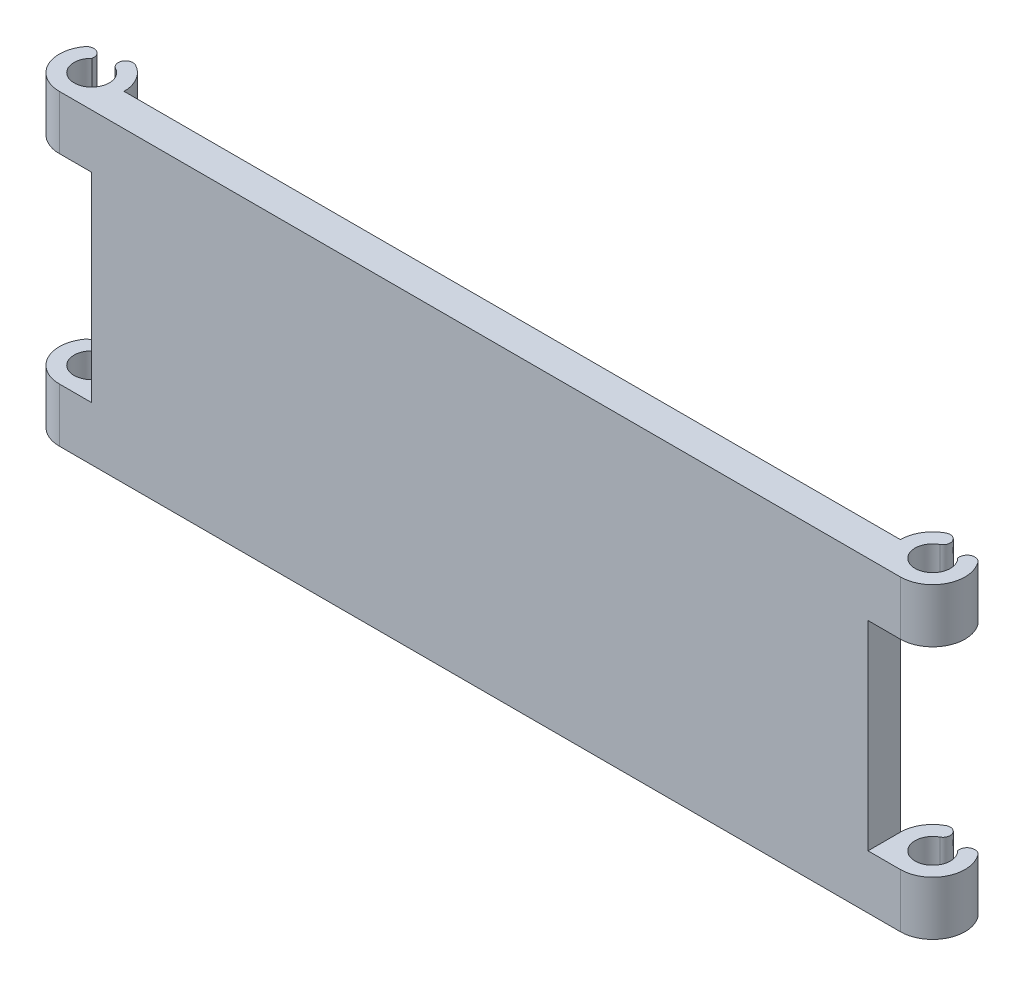
ISO-10303-21;
HEADER;
FILE_DESCRIPTION(('STEP AP214'),'2;1');
FILE_NAME('part.step','',(''),(''),'','','');
FILE_SCHEMA(('AUTOMOTIVE_DESIGN { 1 0 10303 214 1 1 1 1 }'));
ENDSEC;
DATA;
#1=APPLICATION_CONTEXT('core data for automotive mechanical design processes');
#2=APPLICATION_PROTOCOL_DEFINITION('international standard','automotive_design',2000,#1);
#3=PRODUCT_CONTEXT('',#1,'mechanical');
#4=PRODUCT('Part','Part','',(#3));
#5=PRODUCT_RELATED_PRODUCT_CATEGORY('part','',(#4));
#6=PRODUCT_DEFINITION_FORMATION('','',#4);
#7=PRODUCT_DEFINITION_CONTEXT('part definition',#1,'design');
#8=PRODUCT_DEFINITION('design','',#6,#7);
#9=PRODUCT_DEFINITION_SHAPE('','',#8);
#10=(LENGTH_UNIT() NAMED_UNIT(*) SI_UNIT(.MILLI.,.METRE.));
#11=(NAMED_UNIT(*) PLANE_ANGLE_UNIT() SI_UNIT($,.RADIAN.));
#12=(NAMED_UNIT(*) SI_UNIT($,.STERADIAN.) SOLID_ANGLE_UNIT());
#13=UNCERTAINTY_MEASURE_WITH_UNIT(LENGTH_MEASURE(1.E-05),#10,'distance_accuracy_value','');
#14=(GEOMETRIC_REPRESENTATION_CONTEXT(3) GLOBAL_UNCERTAINTY_ASSIGNED_CONTEXT((#13)) GLOBAL_UNIT_ASSIGNED_CONTEXT((#10,
#11,#12)) REPRESENTATION_CONTEXT('',''));
#15=CARTESIAN_POINT('',(0.,0.,0.));
#16=DIRECTION('',(0.,0.,1.));
#17=DIRECTION('',(1.,0.,0.));
#18=AXIS2_PLACEMENT_3D('',#15,#16,#17);
#19=CARTESIAN_POINT('',(-81.6966425521741,57.,-2.67008988531395));
#20=DIRECTION('',(0.,-1.,0.));
#21=DIRECTION('',(0.,0.,-1.));
#22=AXIS2_PLACEMENT_3D('',#19,#20,#21);
#23=CYLINDRICAL_SURFACE('',#22,1.43989625620209);
#24=CARTESIAN_POINT('',(-81.6966425521741,10.,-2.67008988531395));
#25=DIRECTION('',(0.,1.,0.));
#26=DIRECTION('',(0.,0.,1.));
#27=AXIS2_PLACEMENT_3D('',#24,#25,#26);
#28=CIRCLE('',#27,1.43989625620209);
#29=CARTESIAN_POINT('',(-80.2962462943004,10.,-2.33513981506707));
#30=VERTEX_POINT('',#29);
#31=CARTESIAN_POINT('',(-82.8638927005138,10.,-3.51319623674632));
#32=VERTEX_POINT('',#31);
#33=EDGE_CURVE('E293',#30,#32,#28,.T.);
#34=ORIENTED_EDGE('',*,*,#33,.F.);
#35=DIRECTION('',(0.,-1.,0.));
#36=VECTOR('',#35,1.);
#37=CARTESIAN_POINT('',(-80.2962462943004,57.,-2.33513981506707));
#38=LINE('',#37,#36);
#39=CARTESIAN_POINT('',(-80.2962462943004,0.,-2.33513981506707));
#40=VERTEX_POINT('',#39);
#41=EDGE_CURVE('E356',#30,#40,#38,.T.);
#42=ORIENTED_EDGE('',*,*,#41,.T.);
#43=CARTESIAN_POINT('',(-81.6966425521741,0.,-2.67008988531395));
#44=DIRECTION('',(0.,1.,0.));
#45=DIRECTION('',(0.,0.,1.));
#46=AXIS2_PLACEMENT_3D('',#43,#44,#45);
#47=CIRCLE('',#46,1.43989625620209);
#48=CARTESIAN_POINT('',(-82.8638927005138,0.,-3.51319623674632));
#49=VERTEX_POINT('',#48);
#50=EDGE_CURVE('E317',#40,#49,#47,.T.);
#51=ORIENTED_EDGE('',*,*,#50,.T.);
#52=DIRECTION('',(0.,-1.,0.));
#53=VECTOR('',#52,1.);
#54=CARTESIAN_POINT('',(-82.8638927005138,57.,-3.51319623674632));
#55=LINE('',#54,#53);
#56=EDGE_CURVE('E455',#32,#49,#55,.T.);
#57=ORIENTED_EDGE('',*,*,#56,.F.);
#58=EDGE_LOOP('',(#34,#42,#51,#57));
#59=FACE_BOUND('',#58,.T.);
#60=ADVANCED_FACE('F41',(#59),#23,.T.);
#61=CARTESIAN_POINT('',(-78.,57.,0.));
#62=DIRECTION('',(0.,-1.,0.));
#63=DIRECTION('',(0.,0.,-1.));
#64=AXIS2_PLACEMENT_3D('',#61,#62,#63);
#65=CYLINDRICAL_SURFACE('',#64,6.);
#66=CARTESIAN_POINT('',(-78.,10.,0.));
#67=DIRECTION('',(0.,1.,0.));
#68=DIRECTION('',(0.,0.,1.));
#69=AXIS2_PLACEMENT_3D('',#66,#67,#68);
#70=CIRCLE('',#69,6.);
#71=CARTESIAN_POINT('',(-78.,10.,6.));
#72=VERTEX_POINT('',#71);
#73=EDGE_CURVE('E258',#32,#72,#70,.T.);
#74=ORIENTED_EDGE('',*,*,#73,.F.);
#75=ORIENTED_EDGE('',*,*,#56,.T.);
#76=CARTESIAN_POINT('',(-78.,0.,0.));
#77=DIRECTION('',(0.,1.,0.));
#78=DIRECTION('',(0.,0.,1.));
#79=AXIS2_PLACEMENT_3D('',#76,#77,#78);
#80=CIRCLE('',#79,6.);
#81=CARTESIAN_POINT('',(-78.,0.,6.));
#82=VERTEX_POINT('',#81);
#83=EDGE_CURVE('E360',#49,#82,#80,.T.);
#84=ORIENTED_EDGE('',*,*,#83,.T.);
#85=DIRECTION('',(0.,-1.,0.));
#86=VECTOR('',#85,1.);
#87=CARTESIAN_POINT('',(-78.,57.,6.));
#88=LINE('',#87,#86);
#89=EDGE_CURVE('E450',#72,#82,#88,.T.);
#90=ORIENTED_EDGE('',*,*,#89,.F.);
#91=EDGE_LOOP('',(#74,#75,#84,#90));
#92=FACE_BOUND('',#91,.T.);
#93=ADVANCED_FACE('F522',(#92),#65,.T.);
#94=CARTESIAN_POINT('',(78.,57.,6.));
#95=DIRECTION('',(0.,0.,-1.));
#96=DIRECTION('',(-1.,0.,0.));
#97=AXIS2_PLACEMENT_3D('',#94,#95,#96);
#98=PLANE('',#97);
#99=DIRECTION('',(1.,0.,0.));
#100=VECTOR('',#99,1.);
#101=CARTESIAN_POINT('',(78.,10.,6.));
#102=LINE('',#101,#100);
#103=CARTESIAN_POINT('',(72.,10.,6.));
#104=VERTEX_POINT('',#103);
#105=CARTESIAN_POINT('',(78.,10.,6.));
#106=VERTEX_POINT('',#105);
#107=EDGE_CURVE('E226',#104,#106,#102,.T.);
#108=ORIENTED_EDGE('',*,*,#107,.F.);
#109=DIRECTION('',(0.,1.,0.));
#110=VECTOR('',#109,1.);
#111=CARTESIAN_POINT('',(72.,10.,6.));
#112=LINE('',#111,#110);
#113=CARTESIAN_POINT('',(72.,47.,6.));
#114=VERTEX_POINT('',#113);
#115=EDGE_CURVE('E212',#104,#114,#112,.T.);
#116=ORIENTED_EDGE('',*,*,#115,.T.);
#117=DIRECTION('',(1.,0.,0.));
#118=VECTOR('',#117,1.);
#119=CARTESIAN_POINT('',(78.,47.,6.));
#120=LINE('',#119,#118);
#121=CARTESIAN_POINT('',(78.,47.,6.));
#122=VERTEX_POINT('',#121);
#123=EDGE_CURVE('E251',#114,#122,#120,.T.);
#124=ORIENTED_EDGE('',*,*,#123,.T.);
#125=DIRECTION('',(0.,-1.,0.));
#126=VECTOR('',#125,1.);
#127=CARTESIAN_POINT('',(78.,57.,6.));
#128=LINE('',#127,#126);
#129=CARTESIAN_POINT('',(78.,57.,6.));
#130=VERTEX_POINT('',#129);
#131=EDGE_CURVE('E446',#130,#122,#128,.T.);
#132=ORIENTED_EDGE('',*,*,#131,.F.);
#133=DIRECTION('',(1.,0.,0.));
#134=VECTOR('',#133,1.);
#135=CARTESIAN_POINT('',(78.,57.,6.));
#136=LINE('',#135,#134);
#137=CARTESIAN_POINT('',(-78.,57.,6.));
#138=VERTEX_POINT('',#137);
#139=EDGE_CURVE('E326',#138,#130,#136,.T.);
#140=ORIENTED_EDGE('',*,*,#139,.F.);
#141=CARTESIAN_POINT('',(-78.,47.,6.));
#142=VERTEX_POINT('',#141);
#143=EDGE_CURVE('E451',#138,#142,#88,.T.);
#144=ORIENTED_EDGE('',*,*,#143,.T.);
#145=DIRECTION('',(1.,0.,0.));
#146=VECTOR('',#145,1.);
#147=CARTESIAN_POINT('',(-78.,47.,6.));
#148=LINE('',#147,#146);
#149=CARTESIAN_POINT('',(-72.,47.,6.));
#150=VERTEX_POINT('',#149);
#151=EDGE_CURVE('E270',#142,#150,#148,.T.);
#152=ORIENTED_EDGE('',*,*,#151,.T.);
#153=DIRECTION('',(0.,1.,0.));
#154=VECTOR('',#153,1.);
#155=CARTESIAN_POINT('',(-72.,10.,6.));
#156=LINE('',#155,#154);
#157=CARTESIAN_POINT('',(-72.,10.,6.));
#158=VERTEX_POINT('',#157);
#159=EDGE_CURVE('E265',#158,#150,#156,.T.);
#160=ORIENTED_EDGE('',*,*,#159,.F.);
#161=DIRECTION('',(1.,0.,0.));
#162=VECTOR('',#161,1.);
#163=CARTESIAN_POINT('',(-78.,10.,6.));
#164=LINE('',#163,#162);
#165=EDGE_CURVE('E257',#72,#158,#164,.T.);
#166=ORIENTED_EDGE('',*,*,#165,.F.);
#167=ORIENTED_EDGE('',*,*,#89,.T.);
#168=DIRECTION('',(1.,0.,0.));
#169=VECTOR('',#168,1.);
#170=CARTESIAN_POINT('',(78.,0.,6.));
#171=LINE('',#170,#169);
#172=CARTESIAN_POINT('',(78.,0.,6.));
#173=VERTEX_POINT('',#172);
#174=EDGE_CURVE('E364',#82,#173,#171,.T.);
#175=ORIENTED_EDGE('',*,*,#174,.T.);
#176=EDGE_CURVE('E237',#106,#173,#128,.T.);
#177=ORIENTED_EDGE('',*,*,#176,.F.);
#178=EDGE_LOOP('',(#108,#116,#124,#132,#140,#144,#152,#160,#166,#167,#175,#177));
#179=FACE_BOUND('',#178,.T.);
#180=ADVANCED_FACE('F235',(#179),#98,.F.);
#181=CARTESIAN_POINT('',(78.,57.,0.));
#182=DIRECTION('',(0.,-1.,0.));
#183=DIRECTION('',(0.,0.,-1.));
#184=AXIS2_PLACEMENT_3D('',#181,#182,#183);
#185=CYLINDRICAL_SURFACE('',#184,6.);
#186=CARTESIAN_POINT('',(78.,10.,0.));
#187=DIRECTION('',(0.,1.,0.));
#188=DIRECTION('',(0.,0.,1.));
#189=AXIS2_PLACEMENT_3D('',#186,#187,#188);
#190=CIRCLE('',#189,6.);
#191=CARTESIAN_POINT('',(82.8638927005138,10.,-3.51319623674632));
#192=VERTEX_POINT('',#191);
#193=EDGE_CURVE('E232',#106,#192,#190,.T.);
#194=ORIENTED_EDGE('',*,*,#193,.F.);
#195=ORIENTED_EDGE('',*,*,#176,.T.);
#196=CARTESIAN_POINT('',(78.,0.,0.));
#197=DIRECTION('',(0.,1.,0.));
#198=DIRECTION('',(0.,0.,-1.));
#199=AXIS2_PLACEMENT_3D('',#196,#197,#198);
#200=CIRCLE('',#199,6.);
#201=CARTESIAN_POINT('',(82.8638927005138,0.,-3.51319623674633));
#202=VERTEX_POINT('',#201);
#203=EDGE_CURVE('E367',#173,#202,#200,.T.);
#204=ORIENTED_EDGE('',*,*,#203,.T.);
#205=DIRECTION('',(0.,-1.,0.));
#206=VECTOR('',#205,1.);
#207=CARTESIAN_POINT('',(82.8638927005138,57.,-3.51319623674633));
#208=LINE('',#207,#206);
#209=EDGE_CURVE('E441',#192,#202,#208,.T.);
#210=ORIENTED_EDGE('',*,*,#209,.F.);
#211=EDGE_LOOP('',(#194,#195,#204,#210));
#212=FACE_BOUND('',#211,.T.);
#213=ADVANCED_FACE('F578',(#212),#185,.T.);
#214=CARTESIAN_POINT('',(81.6966425521741,57.,-2.67008988531395));
#215=DIRECTION('',(0.,-1.,0.));
#216=DIRECTION('',(0.,0.,-1.));
#217=AXIS2_PLACEMENT_3D('',#214,#215,#216);
#218=CYLINDRICAL_SURFACE('',#217,1.43989625620209);
#219=CARTESIAN_POINT('',(81.6966425521741,10.,-2.67008988531395));
#220=DIRECTION('',(0.,1.,0.));
#221=DIRECTION('',(0.,0.,1.));
#222=AXIS2_PLACEMENT_3D('',#219,#220,#221);
#223=CIRCLE('',#222,1.43989625620209);
#224=CARTESIAN_POINT('',(80.2962462943004,10.,-2.33513981506707));
#225=VERTEX_POINT('',#224);
#226=EDGE_CURVE('E314',#192,#225,#223,.T.);
#227=ORIENTED_EDGE('',*,*,#226,.F.);
#228=ORIENTED_EDGE('',*,*,#209,.T.);
#229=CARTESIAN_POINT('',(81.6966425521741,0.,-2.67008988531395));
#230=DIRECTION('',(0.,1.,0.));
#231=DIRECTION('',(0.,0.,-1.));
#232=AXIS2_PLACEMENT_3D('',#229,#230,#231);
#233=CIRCLE('',#232,1.43989625620209);
#234=CARTESIAN_POINT('',(80.2962462943004,0.,-2.33513981506707));
#235=VERTEX_POINT('',#234);
#236=EDGE_CURVE('E371',#202,#235,#233,.T.);
#237=ORIENTED_EDGE('',*,*,#236,.T.);
#238=DIRECTION('',(0.,-1.,0.));
#239=VECTOR('',#238,1.);
#240=CARTESIAN_POINT('',(80.2962462943004,57.,-2.33513981506707));
#241=LINE('',#240,#239);
#242=EDGE_CURVE('E436',#225,#235,#241,.T.);
#243=ORIENTED_EDGE('',*,*,#242,.F.);
#244=EDGE_LOOP('',(#227,#228,#237,#243));
#245=FACE_BOUND('',#244,.T.);
#246=ADVANCED_FACE('F577',(#245),#218,.T.);
#247=CARTESIAN_POINT('',(78.,57.,0.));
#248=DIRECTION('',(0.,-1.,0.));
#249=DIRECTION('',(0.,0.,-1.));
#250=AXIS2_PLACEMENT_3D('',#247,#248,#249);
#251=CYLINDRICAL_SURFACE('',#250,3.275);
#252=CARTESIAN_POINT('',(78.,10.,0.));
#253=DIRECTION('',(0.,1.,0.));
#254=DIRECTION('',(0.,0.,1.));
#255=AXIS2_PLACEMENT_3D('',#252,#253,#254);
#256=CIRCLE('',#255,3.275);
#257=CARTESIAN_POINT('',(76.4495535986174,10.,-2.8847427886104));
#258=VERTEX_POINT('',#257);
#259=EDGE_CURVE('E311',#225,#258,#256,.F.);
#260=ORIENTED_EDGE('',*,*,#259,.F.);
#261=ORIENTED_EDGE('',*,*,#242,.T.);
#262=CARTESIAN_POINT('',(78.,0.,0.));
#263=DIRECTION('',(0.,-1.,0.));
#264=DIRECTION('',(0.,0.,-1.));
#265=AXIS2_PLACEMENT_3D('',#262,#263,#264);
#266=CIRCLE('',#265,3.275);
#267=CARTESIAN_POINT('',(76.4495535986174,0.,-2.8847427886104));
#268=VERTEX_POINT('',#267);
#269=EDGE_CURVE('E375',#235,#268,#266,.T.);
#270=ORIENTED_EDGE('',*,*,#269,.T.);
#271=DIRECTION('',(0.,-1.,0.));
#272=VECTOR('',#271,1.);
#273=CARTESIAN_POINT('',(76.4495535986174,57.,-2.8847427886104));
#274=LINE('',#273,#272);
#275=EDGE_CURVE('E431',#258,#268,#274,.T.);
#276=ORIENTED_EDGE('',*,*,#275,.F.);
#277=EDGE_LOOP('',(#260,#261,#270,#276));
#278=FACE_BOUND('',#277,.T.);
#279=ADVANCED_FACE('F583',(#278),#251,.F.);
#280=CARTESIAN_POINT('',(75.8045205537674,57.,-4.0848838724216));
#281=DIRECTION('',(0.,-1.,0.));
#282=DIRECTION('',(0.,0.,-1.));
#283=AXIS2_PLACEMENT_3D('',#280,#281,#282);
#284=CYLINDRICAL_SURFACE('',#283,1.3625);
#285=CARTESIAN_POINT('',(75.8045205537674,10.,-4.0848838724216));
#286=DIRECTION('',(0.,1.,0.));
#287=DIRECTION('',(0.,0.,1.));
#288=AXIS2_PLACEMENT_3D('',#285,#286,#287);
#289=CIRCLE('',#288,1.3625);
#290=CARTESIAN_POINT('',(75.1594875089174,10.,-5.2850249562328));
#291=VERTEX_POINT('',#290);
#292=EDGE_CURVE('E308',#258,#291,#289,.T.);
#293=ORIENTED_EDGE('',*,*,#292,.F.);
#294=ORIENTED_EDGE('',*,*,#275,.T.);
#295=CARTESIAN_POINT('',(75.8045205537674,0.,-4.0848838724216));
#296=DIRECTION('',(0.,1.,0.));
#297=DIRECTION('',(0.,0.,1.));
#298=AXIS2_PLACEMENT_3D('',#295,#296,#297);
#299=CIRCLE('',#298,1.3625);
#300=CARTESIAN_POINT('',(75.1594875089174,0.,-5.2850249562328));
#301=VERTEX_POINT('',#300);
#302=EDGE_CURVE('E379',#268,#301,#299,.T.);
#303=ORIENTED_EDGE('',*,*,#302,.T.);
#304=DIRECTION('',(0.,-1.,0.));
#305=VECTOR('',#304,1.);
#306=CARTESIAN_POINT('',(75.1594875089174,57.,-5.2850249562328));
#307=LINE('',#306,#305);
#308=EDGE_CURVE('E426',#291,#301,#307,.T.);
#309=ORIENTED_EDGE('',*,*,#308,.F.);
#310=EDGE_LOOP('',(#293,#294,#303,#309));
#311=FACE_BOUND('',#310,.T.);
#312=ADVANCED_FACE('F586',(#311),#284,.T.);
#313=CARTESIAN_POINT('',(78.,57.,0.));
#314=DIRECTION('',(0.,-1.,0.));
#315=DIRECTION('',(0.,0.,-1.));
#316=AXIS2_PLACEMENT_3D('',#313,#314,#315);
#317=CYLINDRICAL_SURFACE('',#316,6.);
#318=CARTESIAN_POINT('',(72.,10.,0.));
#319=VERTEX_POINT('',#318);
#320=EDGE_CURVE('E229',#291,#319,#190,.T.);
#321=ORIENTED_EDGE('',*,*,#320,.F.);
#322=ORIENTED_EDGE('',*,*,#308,.T.);
#323=CARTESIAN_POINT('',(78.,0.,0.));
#324=DIRECTION('',(0.,1.,0.));
#325=DIRECTION('',(0.,0.,-1.));
#326=AXIS2_PLACEMENT_3D('',#323,#324,#325);
#327=CIRCLE('',#326,6.);
#328=CARTESIAN_POINT('',(72.,0.,0.));
#329=VERTEX_POINT('',#328);
#330=EDGE_CURVE('E383',#301,#329,#327,.T.);
#331=ORIENTED_EDGE('',*,*,#330,.T.);
#332=DIRECTION('',(0.,-1.,0.));
#333=VECTOR('',#332,1.);
#334=CARTESIAN_POINT('',(72.,57.,0.));
#335=LINE('',#334,#333);
#336=EDGE_CURVE('E421',#319,#329,#335,.T.);
#337=ORIENTED_EDGE('',*,*,#336,.F.);
#338=EDGE_LOOP('',(#321,#322,#331,#337));
#339=FACE_BOUND('',#338,.T.);
#340=ADVANCED_FACE('F535',(#339),#317,.T.);
#341=CARTESIAN_POINT('',(-78.,57.,0.));
#342=DIRECTION('',(0.,-1.,0.));
#343=DIRECTION('',(0.,0.,-1.));
#344=AXIS2_PLACEMENT_3D('',#341,#342,#343);
#345=CYLINDRICAL_SURFACE('',#344,6.);
#346=CARTESIAN_POINT('',(-72.,10.,0.));
#347=VERTEX_POINT('',#346);
#348=CARTESIAN_POINT('',(-75.1594875089174,10.,-5.2850249562328));
#349=VERTEX_POINT('',#348);
#350=EDGE_CURVE('E254',#347,#349,#70,.T.);
#351=ORIENTED_EDGE('',*,*,#350,.F.);
#352=DIRECTION('',(0.,-1.,0.));
#353=VECTOR('',#352,1.);
#354=CARTESIAN_POINT('',(-72.,57.,0.));
#355=LINE('',#354,#353);
#356=CARTESIAN_POINT('',(-72.,0.,0.));
#357=VERTEX_POINT('',#356);
#358=EDGE_CURVE('E416',#347,#357,#355,.T.);
#359=ORIENTED_EDGE('',*,*,#358,.T.);
#360=CARTESIAN_POINT('',(-78.,0.,0.));
#361=DIRECTION('',(0.,1.,0.));
#362=DIRECTION('',(0.,0.,1.));
#363=AXIS2_PLACEMENT_3D('',#360,#361,#362);
#364=CIRCLE('',#363,6.);
#365=CARTESIAN_POINT('',(-75.1594875089174,0.,-5.2850249562328));
#366=VERTEX_POINT('',#365);
#367=EDGE_CURVE('E391',#357,#366,#364,.T.);
#368=ORIENTED_EDGE('',*,*,#367,.T.);
#369=DIRECTION('',(0.,-1.,0.));
#370=VECTOR('',#369,1.);
#371=CARTESIAN_POINT('',(-75.1594875089174,57.,-5.2850249562328));
#372=LINE('',#371,#370);
#373=EDGE_CURVE('E411',#349,#366,#372,.T.);
#374=ORIENTED_EDGE('',*,*,#373,.F.);
#375=EDGE_LOOP('',(#351,#359,#368,#374));
#376=FACE_BOUND('',#375,.T.);
#377=ADVANCED_FACE('F496',(#376),#345,.T.);
#378=CARTESIAN_POINT('',(-75.8045205537674,57.,-4.0848838724216));
#379=DIRECTION('',(0.,-1.,0.));
#380=DIRECTION('',(0.,0.,-1.));
#381=AXIS2_PLACEMENT_3D('',#378,#379,#380);
#382=CYLINDRICAL_SURFACE('',#381,1.3625);
#383=CARTESIAN_POINT('',(-75.8045205537674,10.,-4.0848838724216));
#384=DIRECTION('',(0.,1.,0.));
#385=DIRECTION('',(0.,0.,1.));
#386=AXIS2_PLACEMENT_3D('',#383,#384,#385);
#387=CIRCLE('',#386,1.3625);
#388=CARTESIAN_POINT('',(-76.4495535986174,10.,-2.88474278861041));
#389=VERTEX_POINT('',#388);
#390=EDGE_CURVE('E290',#349,#389,#387,.T.);
#391=ORIENTED_EDGE('',*,*,#390,.F.);
#392=ORIENTED_EDGE('',*,*,#373,.T.);
#393=CARTESIAN_POINT('',(-75.8045205537674,0.,-4.0848838724216));
#394=DIRECTION('',(0.,1.,0.));
#395=DIRECTION('',(0.,0.,-1.));
#396=AXIS2_PLACEMENT_3D('',#393,#394,#395);
#397=CIRCLE('',#396,1.3625);
#398=CARTESIAN_POINT('',(-76.4495535986174,0.,-2.88474278861041));
#399=VERTEX_POINT('',#398);
#400=EDGE_CURVE('E395',#366,#399,#397,.T.);
#401=ORIENTED_EDGE('',*,*,#400,.T.);
#402=DIRECTION('',(0.,-1.,0.));
#403=VECTOR('',#402,1.);
#404=CARTESIAN_POINT('',(-76.4495535986174,57.,-2.88474278861041));
#405=LINE('',#404,#403);
#406=EDGE_CURVE('E406',#389,#399,#405,.T.);
#407=ORIENTED_EDGE('',*,*,#406,.F.);
#408=EDGE_LOOP('',(#391,#392,#401,#407));
#409=FACE_BOUND('',#408,.T.);
#410=ADVANCED_FACE('F538',(#409),#382,.T.);
#411=CARTESIAN_POINT('',(-78.,57.,0.));
#412=DIRECTION('',(0.,-1.,0.));
#413=DIRECTION('',(0.,0.,-1.));
#414=AXIS2_PLACEMENT_3D('',#411,#412,#413);
#415=CYLINDRICAL_SURFACE('',#414,3.275);
#416=CARTESIAN_POINT('',(-78.,10.,0.));
#417=DIRECTION('',(0.,1.,0.));
#418=DIRECTION('',(0.,0.,1.));
#419=AXIS2_PLACEMENT_3D('',#416,#417,#418);
#420=CIRCLE('',#419,3.275);
#421=EDGE_CURVE('E11',#389,#30,#420,.F.);
#422=ORIENTED_EDGE('',*,*,#421,.F.);
#423=ORIENTED_EDGE('',*,*,#406,.T.);
#424=CARTESIAN_POINT('',(-78.,0.,0.));
#425=DIRECTION('',(0.,-1.,0.));
#426=DIRECTION('',(0.,0.,1.));
#427=AXIS2_PLACEMENT_3D('',#424,#425,#426);
#428=CIRCLE('',#427,3.275);
#429=EDGE_CURVE('E323',#399,#40,#428,.T.);
#430=ORIENTED_EDGE('',*,*,#429,.T.);
#431=ORIENTED_EDGE('',*,*,#41,.F.);
#432=EDGE_LOOP('',(#422,#423,#430,#431));
#433=FACE_BOUND('',#432,.T.);
#434=ADVANCED_FACE('F512',(#433),#415,.F.);
#435=CARTESIAN_POINT('',(-80.2962462943004,57.,-2.33513981506707));
#436=VERTEX_POINT('',#435);
#437=CARTESIAN_POINT('',(-80.2962462943004,47.,-2.33513981506707));
#438=VERTEX_POINT('',#437);
#439=EDGE_CURVE('E402',#436,#438,#38,.T.);
#440=ORIENTED_EDGE('',*,*,#439,.T.);
#441=CARTESIAN_POINT('',(-81.6966425521741,47.,-2.67008988531395));
#442=DIRECTION('',(0.,1.,0.));
#443=DIRECTION('',(0.,0.,1.));
#444=AXIS2_PLACEMENT_3D('',#441,#442,#443);
#445=CIRCLE('',#444,1.43989625620209);
#446=CARTESIAN_POINT('',(-82.8638927005138,47.,-3.51319623674632));
#447=VERTEX_POINT('',#446);
#448=EDGE_CURVE('E65',#438,#447,#445,.T.);
#449=ORIENTED_EDGE('',*,*,#448,.T.);
#450=CARTESIAN_POINT('',(-82.8638927005138,57.,-3.51319623674632));
#451=VERTEX_POINT('',#450);
#452=EDGE_CURVE('E456',#451,#447,#55,.T.);
#453=ORIENTED_EDGE('',*,*,#452,.F.);
#454=CARTESIAN_POINT('',(-81.6966425521741,57.,-2.67008988531395));
#455=DIRECTION('',(0.,1.,0.));
#456=DIRECTION('',(0.,0.,1.));
#457=AXIS2_PLACEMENT_3D('',#454,#455,#456);
#458=CIRCLE('',#457,1.43989625620209);
#459=EDGE_CURVE('E318',#436,#451,#458,.T.);
#460=ORIENTED_EDGE('',*,*,#459,.F.);
#461=EDGE_LOOP('',(#440,#449,#453,#460));
#462=FACE_BOUND('',#461,.T.);
#463=ADVANCED_FACE('F43',(#462),#23,.T.);
#464=ORIENTED_EDGE('',*,*,#452,.T.);
#465=CARTESIAN_POINT('',(-78.,47.,0.));
#466=DIRECTION('',(0.,1.,0.));
#467=DIRECTION('',(0.,0.,1.));
#468=AXIS2_PLACEMENT_3D('',#465,#466,#467);
#469=CIRCLE('',#468,6.);
#470=EDGE_CURVE('E271',#447,#142,#469,.T.);
#471=ORIENTED_EDGE('',*,*,#470,.T.);
#472=ORIENTED_EDGE('',*,*,#143,.F.);
#473=CARTESIAN_POINT('',(-78.,57.,0.));
#474=DIRECTION('',(0.,1.,0.));
#475=DIRECTION('',(0.,0.,1.));
#476=AXIS2_PLACEMENT_3D('',#473,#474,#475);
#477=CIRCLE('',#476,6.);
#478=EDGE_CURVE('E322',#451,#138,#477,.T.);
#479=ORIENTED_EDGE('',*,*,#478,.F.);
#480=EDGE_LOOP('',(#464,#471,#472,#479));
#481=FACE_BOUND('',#480,.T.);
#482=ADVANCED_FACE('F542',(#481),#65,.T.);
#483=ORIENTED_EDGE('',*,*,#131,.T.);
#484=CARTESIAN_POINT('',(78.,47.,0.));
#485=DIRECTION('',(0.,1.,0.));
#486=DIRECTION('',(0.,0.,1.));
#487=AXIS2_PLACEMENT_3D('',#484,#485,#486);
#488=CIRCLE('',#487,6.);
#489=CARTESIAN_POINT('',(82.8638927005138,47.,-3.51319623674632));
#490=VERTEX_POINT('',#489);
#491=EDGE_CURVE('E244',#122,#490,#488,.T.);
#492=ORIENTED_EDGE('',*,*,#491,.T.);
#493=CARTESIAN_POINT('',(82.8638927005138,57.,-3.51319623674633));
#494=VERTEX_POINT('',#493);
#495=EDGE_CURVE('E442',#494,#490,#208,.T.);
#496=ORIENTED_EDGE('',*,*,#495,.F.);
#497=CARTESIAN_POINT('',(78.,57.,0.));
#498=DIRECTION('',(0.,1.,0.));
#499=DIRECTION('',(0.,0.,-1.));
#500=AXIS2_PLACEMENT_3D('',#497,#498,#499);
#501=CIRCLE('',#500,6.);
#502=EDGE_CURVE('E329',#130,#494,#501,.T.);
#503=ORIENTED_EDGE('',*,*,#502,.F.);
#504=EDGE_LOOP('',(#483,#492,#496,#503));
#505=FACE_BOUND('',#504,.T.);
#506=ADVANCED_FACE('F551',(#505),#185,.T.);
#507=ORIENTED_EDGE('',*,*,#495,.T.);
#508=CARTESIAN_POINT('',(81.6966425521741,47.,-2.67008988531395));
#509=DIRECTION('',(0.,1.,0.));
#510=DIRECTION('',(0.,0.,1.));
#511=AXIS2_PLACEMENT_3D('',#508,#509,#510);
#512=CIRCLE('',#511,1.43989625620209);
#513=CARTESIAN_POINT('',(80.2962462943004,47.,-2.33513981506707));
#514=VERTEX_POINT('',#513);
#515=EDGE_CURVE('E304',#490,#514,#512,.T.);
#516=ORIENTED_EDGE('',*,*,#515,.T.);
#517=CARTESIAN_POINT('',(80.2962462943004,57.,-2.33513981506707));
#518=VERTEX_POINT('',#517);
#519=EDGE_CURVE('E437',#518,#514,#241,.T.);
#520=ORIENTED_EDGE('',*,*,#519,.F.);
#521=CARTESIAN_POINT('',(81.6966425521741,57.,-2.67008988531395));
#522=DIRECTION('',(0.,1.,0.));
#523=DIRECTION('',(0.,0.,-1.));
#524=AXIS2_PLACEMENT_3D('',#521,#522,#523);
#525=CIRCLE('',#524,1.43989625620209);
#526=EDGE_CURVE('E332',#494,#518,#525,.T.);
#527=ORIENTED_EDGE('',*,*,#526,.F.);
#528=EDGE_LOOP('',(#507,#516,#520,#527));
#529=FACE_BOUND('',#528,.T.);
#530=ADVANCED_FACE('F553',(#529),#218,.T.);
#531=ORIENTED_EDGE('',*,*,#519,.T.);
#532=CARTESIAN_POINT('',(78.,47.,0.));
#533=DIRECTION('',(0.,1.,0.));
#534=DIRECTION('',(0.,0.,1.));
#535=AXIS2_PLACEMENT_3D('',#532,#533,#534);
#536=CIRCLE('',#535,3.275);
#537=CARTESIAN_POINT('',(76.4495535986174,47.,-2.8847427886104));
#538=VERTEX_POINT('',#537);
#539=EDGE_CURVE('E300',#514,#538,#536,.F.);
#540=ORIENTED_EDGE('',*,*,#539,.T.);
#541=CARTESIAN_POINT('',(76.4495535986174,57.,-2.8847427886104));
#542=VERTEX_POINT('',#541);
#543=EDGE_CURVE('E432',#542,#538,#274,.T.);
#544=ORIENTED_EDGE('',*,*,#543,.F.);
#545=CARTESIAN_POINT('',(78.,57.,0.));
#546=DIRECTION('',(0.,-1.,0.));
#547=DIRECTION('',(0.,0.,-1.));
#548=AXIS2_PLACEMENT_3D('',#545,#546,#547);
#549=CIRCLE('',#548,3.275);
#550=EDGE_CURVE('E335',#518,#542,#549,.T.);
#551=ORIENTED_EDGE('',*,*,#550,.F.);
#552=EDGE_LOOP('',(#531,#540,#544,#551));
#553=FACE_BOUND('',#552,.T.);
#554=ADVANCED_FACE('F557',(#553),#251,.F.);
#555=ORIENTED_EDGE('',*,*,#543,.T.);
#556=CARTESIAN_POINT('',(75.8045205537674,47.,-4.0848838724216));
#557=DIRECTION('',(0.,1.,0.));
#558=DIRECTION('',(0.,0.,1.));
#559=AXIS2_PLACEMENT_3D('',#556,#557,#558);
#560=CIRCLE('',#559,1.3625);
#561=CARTESIAN_POINT('',(75.1594875089174,47.,-5.2850249562328));
#562=VERTEX_POINT('',#561);
#563=EDGE_CURVE('E296',#538,#562,#560,.T.);
#564=ORIENTED_EDGE('',*,*,#563,.T.);
#565=CARTESIAN_POINT('',(75.1594875089174,57.,-5.2850249562328));
#566=VERTEX_POINT('',#565);
#567=EDGE_CURVE('E427',#566,#562,#307,.T.);
#568=ORIENTED_EDGE('',*,*,#567,.F.);
#569=CARTESIAN_POINT('',(75.8045205537674,57.,-4.0848838724216));
#570=DIRECTION('',(0.,1.,0.));
#571=DIRECTION('',(0.,0.,1.));
#572=AXIS2_PLACEMENT_3D('',#569,#570,#571);
#573=CIRCLE('',#572,1.3625);
#574=EDGE_CURVE('E338',#542,#566,#573,.T.);
#575=ORIENTED_EDGE('',*,*,#574,.F.);
#576=EDGE_LOOP('',(#555,#564,#568,#575));
#577=FACE_BOUND('',#576,.T.);
#578=ADVANCED_FACE('F563',(#577),#284,.T.);
#579=ORIENTED_EDGE('',*,*,#567,.T.);
#580=CARTESIAN_POINT('',(72.,47.,0.));
#581=VERTEX_POINT('',#580);
#582=EDGE_CURVE('E248',#562,#581,#488,.T.);
#583=ORIENTED_EDGE('',*,*,#582,.T.);
#584=CARTESIAN_POINT('',(72.,57.,0.));
#585=VERTEX_POINT('',#584);
#586=EDGE_CURVE('E422',#585,#581,#335,.T.);
#587=ORIENTED_EDGE('',*,*,#586,.F.);
#588=CARTESIAN_POINT('',(78.,57.,0.));
#589=DIRECTION('',(0.,1.,0.));
#590=DIRECTION('',(0.,0.,-1.));
#591=AXIS2_PLACEMENT_3D('',#588,#589,#590);
#592=CIRCLE('',#591,6.);
#593=EDGE_CURVE('E341',#566,#585,#592,.T.);
#594=ORIENTED_EDGE('',*,*,#593,.F.);
#595=EDGE_LOOP('',(#579,#583,#587,#594));
#596=FACE_BOUND('',#595,.T.);
#597=ADVANCED_FACE('F566',(#596),#317,.T.);
#598=CARTESIAN_POINT('',(-72.,57.,0.));
#599=DIRECTION('',(0.,0.,1.));
#600=DIRECTION('',(1.,0.,0.));
#601=AXIS2_PLACEMENT_3D('',#598,#599,#600);
#602=PLANE('',#601);
#603=DIRECTION('',(-1.,0.,0.));
#604=VECTOR('',#603,1.);
#605=CARTESIAN_POINT('',(-72.,0.,0.));
#606=LINE('',#605,#604);
#607=EDGE_CURVE('E387',#329,#357,#606,.T.);
#608=ORIENTED_EDGE('',*,*,#607,.T.);
#609=ORIENTED_EDGE('',*,*,#358,.F.);
#610=DIRECTION('',(0.,1.,0.));
#611=VECTOR('',#610,1.);
#612=CARTESIAN_POINT('',(-72.,10.,0.));
#613=LINE('',#612,#611);
#614=CARTESIAN_POINT('',(-72.,47.,0.));
#615=VERTEX_POINT('',#614);
#616=EDGE_CURVE('E279',#347,#615,#613,.T.);
#617=ORIENTED_EDGE('',*,*,#616,.T.);
#618=CARTESIAN_POINT('',(-72.,57.,0.));
#619=VERTEX_POINT('',#618);
#620=EDGE_CURVE('E417',#619,#615,#355,.T.);
#621=ORIENTED_EDGE('',*,*,#620,.F.);
#622=DIRECTION('',(-1.,0.,0.));
#623=VECTOR('',#622,1.);
#624=CARTESIAN_POINT('',(-72.,57.,0.));
#625=LINE('',#624,#623);
#626=EDGE_CURVE('E344',#585,#619,#625,.T.);
#627=ORIENTED_EDGE('',*,*,#626,.F.);
#628=ORIENTED_EDGE('',*,*,#586,.T.);
#629=DIRECTION('',(0.,1.,0.));
#630=VECTOR('',#629,1.);
#631=CARTESIAN_POINT('',(72.,10.,0.));
#632=LINE('',#631,#630);
#633=EDGE_CURVE('E222',#319,#581,#632,.T.);
#634=ORIENTED_EDGE('',*,*,#633,.F.);
#635=ORIENTED_EDGE('',*,*,#336,.T.);
#636=EDGE_LOOP('',(#608,#609,#617,#621,#627,#628,#634,#635));
#637=FACE_BOUND('',#636,.T.);
#638=ADVANCED_FACE('F483',(#637),#602,.F.);
#639=ORIENTED_EDGE('',*,*,#620,.T.);
#640=CARTESIAN_POINT('',(-75.1594875089174,47.,-5.2850249562328));
#641=VERTEX_POINT('',#640);
#642=EDGE_CURVE('E266',#615,#641,#469,.T.);
#643=ORIENTED_EDGE('',*,*,#642,.T.);
#644=CARTESIAN_POINT('',(-75.1594875089174,57.,-5.2850249562328));
#645=VERTEX_POINT('',#644);
#646=EDGE_CURVE('E412',#645,#641,#372,.T.);
#647=ORIENTED_EDGE('',*,*,#646,.F.);
#648=CARTESIAN_POINT('',(-78.,57.,0.));
#649=DIRECTION('',(0.,1.,0.));
#650=DIRECTION('',(0.,0.,1.));
#651=AXIS2_PLACEMENT_3D('',#648,#649,#650);
#652=CIRCLE('',#651,6.);
#653=EDGE_CURVE('E347',#619,#645,#652,.T.);
#654=ORIENTED_EDGE('',*,*,#653,.F.);
#655=EDGE_LOOP('',(#639,#643,#647,#654));
#656=FACE_BOUND('',#655,.T.);
#657=ADVANCED_FACE('F479',(#656),#345,.T.);
#658=ORIENTED_EDGE('',*,*,#646,.T.);
#659=CARTESIAN_POINT('',(-75.8045205537674,47.,-4.0848838724216));
#660=DIRECTION('',(0.,1.,0.));
#661=DIRECTION('',(0.,0.,1.));
#662=AXIS2_PLACEMENT_3D('',#659,#660,#661);
#663=CIRCLE('',#662,1.3625);
#664=CARTESIAN_POINT('',(-76.4495535986174,47.,-2.88474278861041));
#665=VERTEX_POINT('',#664);
#666=EDGE_CURVE('E221',#641,#665,#663,.T.);
#667=ORIENTED_EDGE('',*,*,#666,.T.);
#668=CARTESIAN_POINT('',(-76.4495535986174,57.,-2.88474278861041));
#669=VERTEX_POINT('',#668);
#670=EDGE_CURVE('E407',#669,#665,#405,.T.);
#671=ORIENTED_EDGE('',*,*,#670,.F.);
#672=CARTESIAN_POINT('',(-75.8045205537674,57.,-4.0848838724216));
#673=DIRECTION('',(0.,1.,0.));
#674=DIRECTION('',(0.,0.,-1.));
#675=AXIS2_PLACEMENT_3D('',#672,#673,#674);
#676=CIRCLE('',#675,1.3625);
#677=EDGE_CURVE('E350',#645,#669,#676,.T.);
#678=ORIENTED_EDGE('',*,*,#677,.F.);
#679=EDGE_LOOP('',(#658,#667,#671,#678));
#680=FACE_BOUND('',#679,.T.);
#681=ADVANCED_FACE('F475',(#680),#382,.T.);
#682=ORIENTED_EDGE('',*,*,#670,.T.);
#683=CARTESIAN_POINT('',(-78.,47.,0.));
#684=DIRECTION('',(0.,1.,0.));
#685=DIRECTION('',(0.,0.,1.));
#686=AXIS2_PLACEMENT_3D('',#683,#684,#685);
#687=CIRCLE('',#686,3.275);
#688=EDGE_CURVE('E50',#665,#438,#687,.F.);
#689=ORIENTED_EDGE('',*,*,#688,.T.);
#690=ORIENTED_EDGE('',*,*,#439,.F.);
#691=CARTESIAN_POINT('',(-78.,57.,0.));
#692=DIRECTION('',(0.,-1.,0.));
#693=DIRECTION('',(0.,0.,1.));
#694=AXIS2_PLACEMENT_3D('',#691,#692,#693);
#695=CIRCLE('',#694,3.275);
#696=EDGE_CURVE('E353',#669,#436,#695,.T.);
#697=ORIENTED_EDGE('',*,*,#696,.F.);
#698=EDGE_LOOP('',(#682,#689,#690,#697));
#699=FACE_BOUND('',#698,.T.);
#700=ADVANCED_FACE('F462',(#699),#415,.F.);
#701=CARTESIAN_POINT('',(-81.6966425521741,57.,-2.67008988531395));
#702=DIRECTION('',(0.,1.,0.));
#703=DIRECTION('',(0.,0.,1.));
#704=AXIS2_PLACEMENT_3D('',#701,#702,#703);
#705=PLANE('',#704);
#706=ORIENTED_EDGE('',*,*,#459,.T.);
#707=ORIENTED_EDGE('',*,*,#478,.T.);
#708=ORIENTED_EDGE('',*,*,#139,.T.);
#709=ORIENTED_EDGE('',*,*,#502,.T.);
#710=ORIENTED_EDGE('',*,*,#526,.T.);
#711=ORIENTED_EDGE('',*,*,#550,.T.);
#712=ORIENTED_EDGE('',*,*,#574,.T.);
#713=ORIENTED_EDGE('',*,*,#593,.T.);
#714=ORIENTED_EDGE('',*,*,#626,.T.);
#715=ORIENTED_EDGE('',*,*,#653,.T.);
#716=ORIENTED_EDGE('',*,*,#677,.T.);
#717=ORIENTED_EDGE('',*,*,#696,.T.);
#718=EDGE_LOOP('',(#706,#707,#708,#709,#710,#711,#712,#713,#714,#715,#716,#717));
#719=FACE_BOUND('',#718,.T.);
#720=ADVANCED_FACE('F469',(#719),#705,.T.);
#721=CARTESIAN_POINT('',(-81.6966425521741,0.,-2.67008988531395));
#722=DIRECTION('',(0.,1.,0.));
#723=DIRECTION('',(0.,0.,1.));
#724=AXIS2_PLACEMENT_3D('',#721,#722,#723);
#725=PLANE('',#724);
#726=ORIENTED_EDGE('',*,*,#50,.F.);
#727=ORIENTED_EDGE('',*,*,#429,.F.);
#728=ORIENTED_EDGE('',*,*,#400,.F.);
#729=ORIENTED_EDGE('',*,*,#367,.F.);
#730=ORIENTED_EDGE('',*,*,#607,.F.);
#731=ORIENTED_EDGE('',*,*,#330,.F.);
#732=ORIENTED_EDGE('',*,*,#302,.F.);
#733=ORIENTED_EDGE('',*,*,#269,.F.);
#734=ORIENTED_EDGE('',*,*,#236,.F.);
#735=ORIENTED_EDGE('',*,*,#203,.F.);
#736=ORIENTED_EDGE('',*,*,#174,.F.);
#737=ORIENTED_EDGE('',*,*,#83,.F.);
#738=EDGE_LOOP('',(#726,#727,#728,#729,#730,#731,#732,#733,#734,#735,#736,#737));
#739=FACE_BOUND('',#738,.T.);
#740=ADVANCED_FACE('F516',(#739),#725,.F.);
#741=CARTESIAN_POINT('',(-78.,10.,0.));
#742=DIRECTION('',(0.,1.,0.));
#743=DIRECTION('',(0.,0.,1.));
#744=AXIS2_PLACEMENT_3D('',#741,#742,#743);
#745=PLANE('',#744);
#746=ORIENTED_EDGE('',*,*,#33,.T.);
#747=ORIENTED_EDGE('',*,*,#73,.T.);
#748=ORIENTED_EDGE('',*,*,#165,.T.);
#749=DIRECTION('',(0.,0.,-1.));
#750=VECTOR('',#749,1.);
#751=CARTESIAN_POINT('',(-72.,10.,0.));
#752=LINE('',#751,#750);
#753=EDGE_CURVE('E261',#158,#347,#752,.T.);
#754=ORIENTED_EDGE('',*,*,#753,.T.);
#755=ORIENTED_EDGE('',*,*,#350,.T.);
#756=ORIENTED_EDGE('',*,*,#390,.T.);
#757=ORIENTED_EDGE('',*,*,#421,.T.);
#758=EDGE_LOOP('',(#746,#747,#748,#754,#755,#756,#757));
#759=FACE_BOUND('',#758,.T.);
#760=ADVANCED_FACE('F491',(#759),#745,.T.);
#761=CARTESIAN_POINT('',(-78.,47.,0.));
#762=DIRECTION('',(0.,1.,0.));
#763=DIRECTION('',(0.,0.,1.));
#764=AXIS2_PLACEMENT_3D('',#761,#762,#763);
#765=PLANE('',#764);
#766=ORIENTED_EDGE('',*,*,#688,.F.);
#767=ORIENTED_EDGE('',*,*,#666,.F.);
#768=ORIENTED_EDGE('',*,*,#642,.F.);
#769=DIRECTION('',(0.,0.,-1.));
#770=VECTOR('',#769,1.);
#771=CARTESIAN_POINT('',(-72.,47.,0.));
#772=LINE('',#771,#770);
#773=EDGE_CURVE('E275',#150,#615,#772,.T.);
#774=ORIENTED_EDGE('',*,*,#773,.F.);
#775=ORIENTED_EDGE('',*,*,#151,.F.);
#776=ORIENTED_EDGE('',*,*,#470,.F.);
#777=ORIENTED_EDGE('',*,*,#448,.F.);
#778=EDGE_LOOP('',(#766,#767,#768,#774,#775,#776,#777));
#779=FACE_BOUND('',#778,.T.);
#780=ADVANCED_FACE('F476',(#779),#765,.F.);
#781=CARTESIAN_POINT('',(-72.,10.,0.));
#782=DIRECTION('',(1.,0.,0.));
#783=DIRECTION('',(0.,0.,-1.));
#784=AXIS2_PLACEMENT_3D('',#781,#782,#783);
#785=PLANE('',#784);
#786=ORIENTED_EDGE('',*,*,#773,.T.);
#787=ORIENTED_EDGE('',*,*,#616,.F.);
#788=ORIENTED_EDGE('',*,*,#753,.F.);
#789=ORIENTED_EDGE('',*,*,#159,.T.);
#790=EDGE_LOOP('',(#786,#787,#788,#789));
#791=FACE_BOUND('',#790,.T.);
#792=ADVANCED_FACE('F487',(#791),#785,.F.);
#793=CARTESIAN_POINT('',(78.,10.,0.));
#794=DIRECTION('',(0.,1.,0.));
#795=DIRECTION('',(0.,0.,1.));
#796=AXIS2_PLACEMENT_3D('',#793,#794,#795);
#797=PLANE('',#796);
#798=ORIENTED_EDGE('',*,*,#226,.T.);
#799=ORIENTED_EDGE('',*,*,#259,.T.);
#800=ORIENTED_EDGE('',*,*,#292,.T.);
#801=ORIENTED_EDGE('',*,*,#320,.T.);
#802=DIRECTION('',(0.,0.,1.));
#803=VECTOR('',#802,1.);
#804=CARTESIAN_POINT('',(72.,10.,0.));
#805=LINE('',#804,#803);
#806=EDGE_CURVE('E57',#319,#104,#805,.T.);
#807=ORIENTED_EDGE('',*,*,#806,.T.);
#808=ORIENTED_EDGE('',*,*,#107,.T.);
#809=ORIENTED_EDGE('',*,*,#193,.T.);
#810=EDGE_LOOP('',(#798,#799,#800,#801,#807,#808,#809));
#811=FACE_BOUND('',#810,.T.);
#812=ADVANCED_FACE('F225',(#811),#797,.T.);
#813=CARTESIAN_POINT('',(78.,47.,0.));
#814=DIRECTION('',(0.,1.,0.));
#815=DIRECTION('',(0.,0.,1.));
#816=AXIS2_PLACEMENT_3D('',#813,#814,#815);
#817=PLANE('',#816);
#818=ORIENTED_EDGE('',*,*,#491,.F.);
#819=ORIENTED_EDGE('',*,*,#123,.F.);
#820=DIRECTION('',(0.,0.,1.));
#821=VECTOR('',#820,1.);
#822=CARTESIAN_POINT('',(72.,47.,0.));
#823=LINE('',#822,#821);
#824=EDGE_CURVE('E215',#581,#114,#823,.T.);
#825=ORIENTED_EDGE('',*,*,#824,.F.);
#826=ORIENTED_EDGE('',*,*,#582,.F.);
#827=ORIENTED_EDGE('',*,*,#563,.F.);
#828=ORIENTED_EDGE('',*,*,#539,.F.);
#829=ORIENTED_EDGE('',*,*,#515,.F.);
#830=EDGE_LOOP('',(#818,#819,#825,#826,#827,#828,#829));
#831=FACE_BOUND('',#830,.T.);
#832=ADVANCED_FACE('F681',(#831),#817,.F.);
#833=CARTESIAN_POINT('',(72.,10.,0.));
#834=DIRECTION('',(-1.,0.,0.));
#835=DIRECTION('',(0.,0.,1.));
#836=AXIS2_PLACEMENT_3D('',#833,#834,#835);
#837=PLANE('',#836);
#838=ORIENTED_EDGE('',*,*,#824,.T.);
#839=ORIENTED_EDGE('',*,*,#115,.F.);
#840=ORIENTED_EDGE('',*,*,#806,.F.);
#841=ORIENTED_EDGE('',*,*,#633,.T.);
#842=EDGE_LOOP('',(#838,#839,#840,#841));
#843=FACE_BOUND('',#842,.T.);
#844=ADVANCED_FACE('F213',(#843),#837,.F.);
#845=CLOSED_SHELL('',(#60,#93,#180,#213,#246,#279,#312,#340,#377,#410,#434,#463,#482,#506,#530,
#554,#578,#597,#638,#657,#681,#700,#720,#740,#760,#780,#792,#812,#832,#844));
#846=MANIFOLD_SOLID_BREP('B2',#845);
#847=ADVANCED_BREP_SHAPE_REPRESENTATION('',(#18,#846),#14);
#848=SHAPE_DEFINITION_REPRESENTATION(#9,#847);
ENDSEC;
END-ISO-10303-21;
